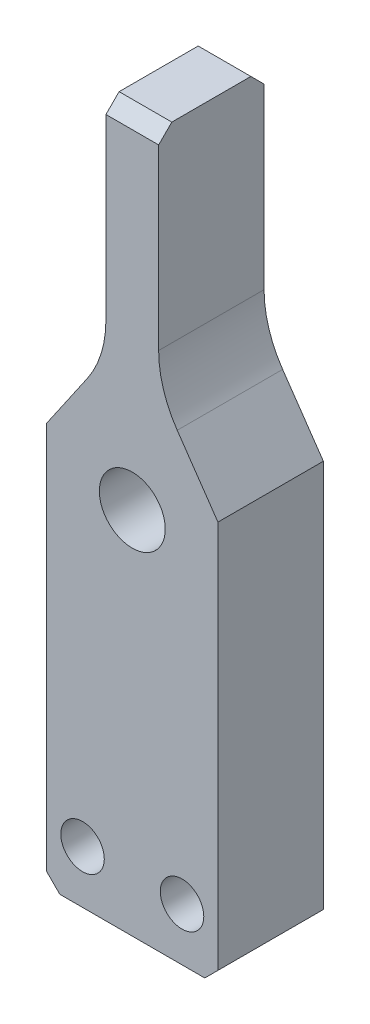
ISO-10303-21;
HEADER;
FILE_DESCRIPTION(('STEP AP214'),'2;1');
FILE_NAME('part.step','',(''),(''),'','','');
FILE_SCHEMA(('AUTOMOTIVE_DESIGN { 1 0 10303 214 1 1 1 1 }'));
ENDSEC;
DATA;
#1=APPLICATION_CONTEXT('core data for automotive mechanical design processes');
#2=APPLICATION_PROTOCOL_DEFINITION('international standard','automotive_design',2000,#1);
#3=PRODUCT_CONTEXT('',#1,'mechanical');
#4=PRODUCT('Part','Part','',(#3));
#5=PRODUCT_RELATED_PRODUCT_CATEGORY('part','',(#4));
#6=PRODUCT_DEFINITION_FORMATION('','',#4);
#7=PRODUCT_DEFINITION_CONTEXT('part definition',#1,'design');
#8=PRODUCT_DEFINITION('design','',#6,#7);
#9=PRODUCT_DEFINITION_SHAPE('','',#8);
#10=(LENGTH_UNIT() NAMED_UNIT(*) SI_UNIT(.MILLI.,.METRE.));
#11=(NAMED_UNIT(*) PLANE_ANGLE_UNIT() SI_UNIT($,.RADIAN.));
#12=(NAMED_UNIT(*) SI_UNIT($,.STERADIAN.) SOLID_ANGLE_UNIT());
#13=UNCERTAINTY_MEASURE_WITH_UNIT(LENGTH_MEASURE(1.E-05),#10,'distance_accuracy_value','');
#14=(GEOMETRIC_REPRESENTATION_CONTEXT(3) GLOBAL_UNCERTAINTY_ASSIGNED_CONTEXT((#13)) GLOBAL_UNIT_ASSIGNED_CONTEXT((#10,
#11,#12)) REPRESENTATION_CONTEXT('',''));
#15=CARTESIAN_POINT('',(0.,0.,0.));
#16=DIRECTION('',(0.,0.,1.));
#17=DIRECTION('',(1.,0.,0.));
#18=AXIS2_PLACEMENT_3D('',#15,#16,#17);
#19=CARTESIAN_POINT('',(-6.5,27.5,8.));
#20=DIRECTION('',(1.,0.,0.));
#21=DIRECTION('',(0.,1.,0.));
#22=AXIS2_PLACEMENT_3D('',#19,#20,#21);
#23=PLANE('',#22);
#24=DIRECTION('',(0.,-1.,0.));
#25=VECTOR('',#24,1.);
#26=CARTESIAN_POINT('',(-6.5,27.5,8.));
#27=LINE('',#26,#25);
#28=CARTESIAN_POINT('',(-6.5,2.96165158468899,8.));
#29=VERTEX_POINT('',#28);
#30=CARTESIAN_POINT('',(-6.49999999999999,-26.5,8.));
#31=VERTEX_POINT('',#30);
#32=EDGE_CURVE('E163',#29,#31,#27,.T.);
#33=ORIENTED_EDGE('',*,*,#32,.F.);
#34=DIRECTION('',(0.,0.,-1.));
#35=VECTOR('',#34,1.);
#36=CARTESIAN_POINT('',(-6.5,2.96165158468899,8.));
#37=LINE('',#36,#35);
#38=CARTESIAN_POINT('',(-6.49999999999999,2.96165158468902,0.));
#39=VERTEX_POINT('',#38);
#40=EDGE_CURVE('E194',#29,#39,#37,.T.);
#41=ORIENTED_EDGE('',*,*,#40,.T.);
#42=DIRECTION('',(0.,-1.,0.));
#43=VECTOR('',#42,1.);
#44=CARTESIAN_POINT('',(-6.5,27.5,0.));
#45=LINE('',#44,#43);
#46=CARTESIAN_POINT('',(-6.5,-26.5,0.));
#47=VERTEX_POINT('',#46);
#48=EDGE_CURVE('E168',#39,#47,#45,.T.);
#49=ORIENTED_EDGE('',*,*,#48,.T.);
#50=DIRECTION('',(0.,0.,1.));
#51=VECTOR('',#50,1.);
#52=CARTESIAN_POINT('',(-6.5,-26.5,8.));
#53=LINE('',#52,#51);
#54=EDGE_CURVE('E181',#47,#31,#53,.T.);
#55=ORIENTED_EDGE('',*,*,#54,.T.);
#56=EDGE_LOOP('',(#33,#41,#49,#55));
#57=FACE_BOUND('',#56,.T.);
#58=ADVANCED_FACE('F36',(#57),#23,.F.);
#59=CARTESIAN_POINT('',(6.50000000000001,-27.5,8.));
#60=DIRECTION('',(0.,1.,0.));
#61=DIRECTION('',(0.,0.,1.));
#62=AXIS2_PLACEMENT_3D('',#59,#60,#61);
#63=PLANE('',#62);
#64=DIRECTION('',(1.,0.,0.));
#65=VECTOR('',#64,1.);
#66=CARTESIAN_POINT('',(6.50000000000001,-27.5,0.));
#67=LINE('',#66,#65);
#68=CARTESIAN_POINT('',(-5.50000000000001,-27.5,0.));
#69=VERTEX_POINT('',#68);
#70=CARTESIAN_POINT('',(5.5,-27.5,0.));
#71=VERTEX_POINT('',#70);
#72=EDGE_CURVE('E164',#69,#71,#67,.T.);
#73=ORIENTED_EDGE('',*,*,#72,.T.);
#74=DIRECTION('',(0.,0.,1.));
#75=VECTOR('',#74,1.);
#76=CARTESIAN_POINT('',(5.5,-27.5,8.));
#77=LINE('',#76,#75);
#78=CARTESIAN_POINT('',(5.5,-27.5,8.));
#79=VERTEX_POINT('',#78);
#80=EDGE_CURVE('E141',#71,#79,#77,.T.);
#81=ORIENTED_EDGE('',*,*,#80,.T.);
#82=DIRECTION('',(1.,0.,0.));
#83=VECTOR('',#82,1.);
#84=CARTESIAN_POINT('',(6.50000000000001,-27.5,8.));
#85=LINE('',#84,#83);
#86=CARTESIAN_POINT('',(-5.5,-27.5,8.));
#87=VERTEX_POINT('',#86);
#88=EDGE_CURVE('E166',#87,#79,#85,.T.);
#89=ORIENTED_EDGE('',*,*,#88,.F.);
#90=DIRECTION('',(0.,0.,-1.));
#91=VECTOR('',#90,1.);
#92=CARTESIAN_POINT('',(-5.5,-27.5,8.));
#93=LINE('',#92,#91);
#94=EDGE_CURVE('E146',#87,#69,#93,.T.);
#95=ORIENTED_EDGE('',*,*,#94,.T.);
#96=EDGE_LOOP('',(#73,#81,#89,#95));
#97=FACE_BOUND('',#96,.T.);
#98=ADVANCED_FACE('F310',(#97),#63,.F.);
#99=CARTESIAN_POINT('',(6.5,27.5,8.));
#100=DIRECTION('',(-1.,0.,0.));
#101=DIRECTION('',(0.,-1.,0.));
#102=AXIS2_PLACEMENT_3D('',#99,#100,#101);
#103=PLANE('',#102);
#104=DIRECTION('',(0.,1.,0.));
#105=VECTOR('',#104,1.);
#106=CARTESIAN_POINT('',(6.5,27.5,0.));
#107=LINE('',#106,#105);
#108=CARTESIAN_POINT('',(6.50000000000001,-26.5,0.));
#109=VERTEX_POINT('',#108);
#110=CARTESIAN_POINT('',(6.5,2.96165158468892,0.));
#111=VERTEX_POINT('',#110);
#112=EDGE_CURVE('E154',#109,#111,#107,.T.);
#113=ORIENTED_EDGE('',*,*,#112,.T.);
#114=DIRECTION('',(0.,0.,1.));
#115=VECTOR('',#114,1.);
#116=CARTESIAN_POINT('',(6.5,2.96165158468891,8.));
#117=LINE('',#116,#115);
#118=CARTESIAN_POINT('',(6.5,2.96165158468893,8.));
#119=VERTEX_POINT('',#118);
#120=EDGE_CURVE('E184',#111,#119,#117,.T.);
#121=ORIENTED_EDGE('',*,*,#120,.T.);
#122=DIRECTION('',(0.,1.,0.));
#123=VECTOR('',#122,1.);
#124=CARTESIAN_POINT('',(6.5,27.5,8.));
#125=LINE('',#124,#123);
#126=CARTESIAN_POINT('',(6.50000000000001,-26.5,8.));
#127=VERTEX_POINT('',#126);
#128=EDGE_CURVE('E157',#127,#119,#125,.T.);
#129=ORIENTED_EDGE('',*,*,#128,.F.);
#130=DIRECTION('',(0.,0.,-1.));
#131=VECTOR('',#130,1.);
#132=CARTESIAN_POINT('',(6.50000000000001,-26.5,8.));
#133=LINE('',#132,#131);
#134=EDGE_CURVE('E140',#127,#109,#133,.T.);
#135=ORIENTED_EDGE('',*,*,#134,.T.);
#136=EDGE_LOOP('',(#113,#121,#129,#135));
#137=FACE_BOUND('',#136,.T.);
#138=ADVANCED_FACE('F152',(#137),#103,.F.);
#139=CARTESIAN_POINT('',(0.,0.,8.));
#140=DIRECTION('',(0.,0.,-1.));
#141=DIRECTION('',(-1.,0.,0.));
#142=AXIS2_PLACEMENT_3D('',#139,#140,#141);
#143=PLANE('',#142);
#144=CARTESIAN_POINT('',(-3.77499999991079,-23.5,8.));
#145=DIRECTION('',(0.,0.,1.));
#146=DIRECTION('',(1.,0.,0.));
#147=AXIS2_PLACEMENT_3D('',#144,#145,#146);
#148=CIRCLE('',#147,1.64999999999999);
#149=CARTESIAN_POINT('',(-2.1249999999108,-23.5,8.));
#150=VERTEX_POINT('',#149);
#151=EDGE_CURVE('E275',#150,#150,#148,.T.);
#152=ORIENTED_EDGE('',*,*,#151,.F.);
#153=EDGE_LOOP('',(#152));
#154=FACE_BOUND('',#153,.T.);
#155=CARTESIAN_POINT('',(3.77499999994489,-23.5,8.));
#156=DIRECTION('',(0.,0.,1.));
#157=DIRECTION('',(1.,0.,0.));
#158=AXIS2_PLACEMENT_3D('',#155,#156,#157);
#159=CIRCLE('',#158,1.64999999999999);
#160=CARTESIAN_POINT('',(5.42499999994488,-23.5,8.));
#161=VERTEX_POINT('',#160);
#162=EDGE_CURVE('E269',#161,#161,#159,.T.);
#163=ORIENTED_EDGE('',*,*,#162,.F.);
#164=EDGE_LOOP('',(#163));
#165=FACE_BOUND('',#164,.T.);
#166=CARTESIAN_POINT('',(0.,0.500000000000004,8.));
#167=DIRECTION('',(0.,0.,1.));
#168=DIRECTION('',(1.,0.,0.));
#169=AXIS2_PLACEMENT_3D('',#166,#167,#168);
#170=CIRCLE('',#169,2.5);
#171=CARTESIAN_POINT('',(2.5,0.500000000000004,8.));
#172=VERTEX_POINT('',#171);
#173=EDGE_CURVE('E255',#172,#172,#170,.T.);
#174=ORIENTED_EDGE('',*,*,#173,.F.);
#175=EDGE_LOOP('',(#174));
#176=FACE_BOUND('',#175,.T.);
#177=DIRECTION('',(0.,-1.,0.));
#178=VECTOR('',#177,1.);
#179=CARTESIAN_POINT('',(2.,27.5,8.));
#180=LINE('',#179,#178);
#181=CARTESIAN_POINT('',(2.,25.5,8.));
#182=VERTEX_POINT('',#181);
#183=CARTESIAN_POINT('',(2.,11.9869431429027,8.));
#184=VERTEX_POINT('',#183);
#185=EDGE_CURVE('E232',#182,#184,#180,.T.);
#186=ORIENTED_EDGE('',*,*,#185,.F.);
#187=DIRECTION('',(-1.,0.,0.));
#188=VECTOR('',#187,1.);
#189=CARTESIAN_POINT('',(0.,25.5,8.));
#190=LINE('',#189,#188);
#191=CARTESIAN_POINT('',(-2.,25.5,8.));
#192=VERTEX_POINT('',#191);
#193=EDGE_CURVE('E213',#182,#192,#190,.T.);
#194=ORIENTED_EDGE('',*,*,#193,.T.);
#195=DIRECTION('',(0.,1.,0.));
#196=VECTOR('',#195,1.);
#197=CARTESIAN_POINT('',(-2.,27.5,8.));
#198=LINE('',#197,#196);
#199=CARTESIAN_POINT('',(-2.,11.9869431429027,8.));
#200=VERTEX_POINT('',#199);
#201=EDGE_CURVE('E263',#200,#192,#198,.T.);
#202=ORIENTED_EDGE('',*,*,#201,.F.);
#203=CARTESIAN_POINT('',(-10.,11.9869431429027,8.));
#204=DIRECTION('',(0.,0.,-1.));
#205=DIRECTION('',(-1.,0.,0.));
#206=AXIS2_PLACEMENT_3D('',#203,#204,#205);
#207=CIRCLE('',#206,8.);
#208=CARTESIAN_POINT('',(-3.40996423161669,7.45136946679193,8.));
#209=VERTEX_POINT('',#208);
#210=EDGE_CURVE('E44',#200,#209,#207,.T.);
#211=ORIENTED_EDGE('',*,*,#210,.T.);
#212=DIRECTION('',(-0.566946709513842,-0.823754471047913,0.));
#213=VECTOR('',#212,1.);
#214=CARTESIAN_POINT('',(-3.28571428571426,7.6319004527683,8.));
#215=LINE('',#214,#213);
#216=EDGE_CURVE('E186',#209,#29,#215,.T.);
#217=ORIENTED_EDGE('',*,*,#216,.T.);
#218=ORIENTED_EDGE('',*,*,#32,.T.);
#219=DIRECTION('',(-0.707106781186545,0.70710678118655,0.));
#220=VECTOR('',#219,1.);
#221=CARTESIAN_POINT('',(-5.5,-27.5,8.));
#222=LINE('',#221,#220);
#223=EDGE_CURVE('E177',#31,#87,#222,.F.);
#224=ORIENTED_EDGE('',*,*,#223,.T.);
#225=ORIENTED_EDGE('',*,*,#88,.T.);
#226=DIRECTION('',(-0.70710678118655,-0.707106781186545,0.));
#227=VECTOR('',#226,1.);
#228=CARTESIAN_POINT('',(6.50000000000001,-26.5,8.));
#229=LINE('',#228,#227);
#230=EDGE_CURVE('E179',#79,#127,#229,.F.);
#231=ORIENTED_EDGE('',*,*,#230,.T.);
#232=ORIENTED_EDGE('',*,*,#128,.T.);
#233=DIRECTION('',(-0.566946709513834,0.823754471047919,0.));
#234=VECTOR('',#233,1.);
#235=CARTESIAN_POINT('',(6.5,2.96165158468891,8.));
#236=LINE('',#235,#234);
#237=CARTESIAN_POINT('',(3.40996423161665,7.45136946679201,8.));
#238=VERTEX_POINT('',#237);
#239=EDGE_CURVE('E188',#119,#238,#236,.T.);
#240=ORIENTED_EDGE('',*,*,#239,.T.);
#241=CARTESIAN_POINT('',(10.,11.9869431429027,8.));
#242=DIRECTION('',(0.,0.,-1.));
#243=DIRECTION('',(-1.,0.,0.));
#244=AXIS2_PLACEMENT_3D('',#241,#242,#243);
#245=CIRCLE('',#244,8.);
#246=EDGE_CURVE('E227',#238,#184,#245,.T.);
#247=ORIENTED_EDGE('',*,*,#246,.T.);
#248=EDGE_LOOP('',(#186,#194,#202,#211,#217,#218,#224,#225,#231,#232,#240,#247));
#249=FACE_BOUND('',#248,.T.);
#250=ADVANCED_FACE('F231',(#154,#165,#176,#249),#143,.F.);
#251=CARTESIAN_POINT('',(0.,0.,0.));
#252=DIRECTION('',(0.,0.,-1.));
#253=DIRECTION('',(-1.,0.,0.));
#254=AXIS2_PLACEMENT_3D('',#251,#252,#253);
#255=PLANE('',#254);
#256=DIRECTION('',(0.566946709513842,0.823754471047913,0.));
#257=VECTOR('',#256,1.);
#258=CARTESIAN_POINT('',(-5.79387928181817,3.98762120218729,0.));
#259=LINE('',#258,#257);
#260=CARTESIAN_POINT('',(-3.40996423161669,7.45136946679193,0.));
#261=VERTEX_POINT('',#260);
#262=EDGE_CURVE('E191',#39,#261,#259,.T.);
#263=ORIENTED_EDGE('',*,*,#262,.T.);
#264=CARTESIAN_POINT('',(-10.,11.9869431429027,0.));
#265=DIRECTION('',(0.,0.,-1.));
#266=DIRECTION('',(-1.,0.,0.));
#267=AXIS2_PLACEMENT_3D('',#264,#265,#266);
#268=CIRCLE('',#267,8.);
#269=CARTESIAN_POINT('',(-2.,11.9869431429027,0.));
#270=VERTEX_POINT('',#269);
#271=EDGE_CURVE('E11',#261,#270,#268,.F.);
#272=ORIENTED_EDGE('',*,*,#271,.T.);
#273=DIRECTION('',(0.,1.,0.));
#274=VECTOR('',#273,1.);
#275=CARTESIAN_POINT('',(-2.,27.5,0.));
#276=LINE('',#275,#274);
#277=CARTESIAN_POINT('',(-2.,25.5,0.));
#278=VERTEX_POINT('',#277);
#279=EDGE_CURVE('E243',#270,#278,#276,.T.);
#280=ORIENTED_EDGE('',*,*,#279,.T.);
#281=DIRECTION('',(1.,0.,0.));
#282=VECTOR('',#281,1.);
#283=CARTESIAN_POINT('',(2.,25.5,0.));
#284=LINE('',#283,#282);
#285=CARTESIAN_POINT('',(2.,25.5,0.));
#286=VERTEX_POINT('',#285);
#287=EDGE_CURVE('E207',#278,#286,#284,.T.);
#288=ORIENTED_EDGE('',*,*,#287,.T.);
#289=DIRECTION('',(0.,-1.,0.));
#290=VECTOR('',#289,1.);
#291=CARTESIAN_POINT('',(2.,27.5,0.));
#292=LINE('',#291,#290);
#293=CARTESIAN_POINT('',(2.,11.9869431429027,0.));
#294=VERTEX_POINT('',#293);
#295=EDGE_CURVE('E242',#286,#294,#292,.T.);
#296=ORIENTED_EDGE('',*,*,#295,.T.);
#297=CARTESIAN_POINT('',(10.,11.9869431429027,0.));
#298=DIRECTION('',(0.,0.,-1.));
#299=DIRECTION('',(-1.,0.,0.));
#300=AXIS2_PLACEMENT_3D('',#297,#298,#299);
#301=CIRCLE('',#300,8.);
#302=CARTESIAN_POINT('',(3.40996423161665,7.45136946679201,0.));
#303=VERTEX_POINT('',#302);
#304=EDGE_CURVE('E225',#294,#303,#301,.F.);
#305=ORIENTED_EDGE('',*,*,#304,.T.);
#306=DIRECTION('',(0.566946709513834,-0.823754471047919,0.));
#307=VECTOR('',#306,1.);
#308=CARTESIAN_POINT('',(5.79387928181819,3.98762120218722,0.));
#309=LINE('',#308,#307);
#310=EDGE_CURVE('E162',#303,#111,#309,.T.);
#311=ORIENTED_EDGE('',*,*,#310,.T.);
#312=ORIENTED_EDGE('',*,*,#112,.F.);
#313=DIRECTION('',(0.70710678118655,0.707106781186545,0.));
#314=VECTOR('',#313,1.);
#315=CARTESIAN_POINT('',(16.5,-16.5000000000001,0.));
#316=LINE('',#315,#314);
#317=EDGE_CURVE('E136',#109,#71,#316,.F.);
#318=ORIENTED_EDGE('',*,*,#317,.T.);
#319=ORIENTED_EDGE('',*,*,#72,.F.);
#320=DIRECTION('',(0.707106781186545,-0.70710678118655,0.));
#321=VECTOR('',#320,1.);
#322=CARTESIAN_POINT('',(-16.5,-16.4999999999999,0.));
#323=LINE('',#322,#321);
#324=EDGE_CURVE('E147',#69,#47,#323,.F.);
#325=ORIENTED_EDGE('',*,*,#324,.T.);
#326=ORIENTED_EDGE('',*,*,#48,.F.);
#327=EDGE_LOOP('',(#263,#272,#280,#288,#296,#305,#311,#312,#318,#319,#325,#326));
#328=FACE_BOUND('',#327,.T.);
#329=CARTESIAN_POINT('',(-3.77499999991079,-23.5,0.));
#330=DIRECTION('',(0.,0.,1.));
#331=DIRECTION('',(1.,0.,0.));
#332=AXIS2_PLACEMENT_3D('',#329,#330,#331);
#333=CIRCLE('',#332,1.65);
#334=CARTESIAN_POINT('',(-2.12499999991079,-23.5,0.));
#335=VERTEX_POINT('',#334);
#336=EDGE_CURVE('E272',#335,#335,#333,.T.);
#337=ORIENTED_EDGE('',*,*,#336,.T.);
#338=EDGE_LOOP('',(#337));
#339=FACE_BOUND('',#338,.T.);
#340=CARTESIAN_POINT('',(3.77499999994489,-23.5,0.));
#341=DIRECTION('',(0.,0.,1.));
#342=DIRECTION('',(1.,0.,0.));
#343=AXIS2_PLACEMENT_3D('',#340,#341,#342);
#344=CIRCLE('',#343,1.65);
#345=CARTESIAN_POINT('',(5.42499999994489,-23.5,0.));
#346=VERTEX_POINT('',#345);
#347=EDGE_CURVE('E265',#346,#346,#344,.T.);
#348=ORIENTED_EDGE('',*,*,#347,.T.);
#349=EDGE_LOOP('',(#348));
#350=FACE_BOUND('',#349,.T.);
#351=CARTESIAN_POINT('',(0.,0.500000000000004,0.));
#352=DIRECTION('',(0.,0.,1.));
#353=DIRECTION('',(1.,0.,0.));
#354=AXIS2_PLACEMENT_3D('',#351,#352,#353);
#355=CIRCLE('',#354,2.5);
#356=CARTESIAN_POINT('',(2.5,0.500000000000004,0.));
#357=VERTEX_POINT('',#356);
#358=EDGE_CURVE('E251',#357,#357,#355,.T.);
#359=ORIENTED_EDGE('',*,*,#358,.T.);
#360=EDGE_LOOP('',(#359));
#361=FACE_BOUND('',#360,.T.);
#362=ADVANCED_FACE('F159',(#328,#339,#350,#361),#255,.T.);
#363=CARTESIAN_POINT('',(0.,0.500000000000004,8.));
#364=DIRECTION('',(0.,0.,1.));
#365=DIRECTION('',(1.,0.,0.));
#366=AXIS2_PLACEMENT_3D('',#363,#364,#365);
#367=CYLINDRICAL_SURFACE('',#366,2.5);
#368=ORIENTED_EDGE('',*,*,#358,.F.);
#369=EDGE_LOOP('',(#368));
#370=FACE_BOUND('',#369,.T.);
#371=ORIENTED_EDGE('',*,*,#173,.T.);
#372=EDGE_LOOP('',(#371));
#373=FACE_BOUND('',#372,.T.);
#374=ADVANCED_FACE('F335',(#370,#373),#367,.F.);
#375=CARTESIAN_POINT('',(2.,27.5,0.));
#376=DIRECTION('',(-1.,0.,0.));
#377=DIRECTION('',(0.,-1.,0.));
#378=AXIS2_PLACEMENT_3D('',#375,#376,#377);
#379=PLANE('',#378);
#380=ORIENTED_EDGE('',*,*,#185,.T.);
#381=DIRECTION('',(0.,0.,-1.));
#382=VECTOR('',#381,1.);
#383=CARTESIAN_POINT('',(2.,11.9869431429027,0.));
#384=LINE('',#383,#382);
#385=EDGE_CURVE('E216',#184,#294,#384,.T.);
#386=ORIENTED_EDGE('',*,*,#385,.T.);
#387=ORIENTED_EDGE('',*,*,#295,.F.);
#388=DIRECTION('',(0.,0.70710678118655,0.707106781186545));
#389=VECTOR('',#388,1.);
#390=CARTESIAN_POINT('',(2.,26.5,1.));
#391=LINE('',#390,#389);
#392=CARTESIAN_POINT('',(2.,26.5,1.));
#393=VERTEX_POINT('',#392);
#394=EDGE_CURVE('E211',#286,#393,#391,.T.);
#395=ORIENTED_EDGE('',*,*,#394,.T.);
#396=DIRECTION('',(0.,0.,-1.));
#397=VECTOR('',#396,1.);
#398=CARTESIAN_POINT('',(2.,26.5,0.));
#399=LINE('',#398,#397);
#400=CARTESIAN_POINT('',(2.,26.5,7.));
#401=VERTEX_POINT('',#400);
#402=EDGE_CURVE('E281',#401,#393,#399,.T.);
#403=ORIENTED_EDGE('',*,*,#402,.F.);
#404=DIRECTION('',(0.,0.70710678118655,-0.707106781186545));
#405=VECTOR('',#404,1.);
#406=CARTESIAN_POINT('',(2.,26.5,7.));
#407=LINE('',#406,#405);
#408=EDGE_CURVE('E209',#401,#182,#407,.F.);
#409=ORIENTED_EDGE('',*,*,#408,.T.);
#410=EDGE_LOOP('',(#380,#386,#387,#395,#403,#409));
#411=FACE_BOUND('',#410,.T.);
#412=ADVANCED_FACE('F238',(#411),#379,.F.);
#413=CARTESIAN_POINT('',(-2.,27.5,0.));
#414=DIRECTION('',(1.,0.,0.));
#415=DIRECTION('',(0.,0.,-1.));
#416=AXIS2_PLACEMENT_3D('',#413,#414,#415);
#417=PLANE('',#416);
#418=ORIENTED_EDGE('',*,*,#279,.F.);
#419=DIRECTION('',(0.,0.,1.));
#420=VECTOR('',#419,1.);
#421=CARTESIAN_POINT('',(-2.,11.9869431429027,0.));
#422=LINE('',#421,#420);
#423=EDGE_CURVE('E221',#270,#200,#422,.T.);
#424=ORIENTED_EDGE('',*,*,#423,.T.);
#425=ORIENTED_EDGE('',*,*,#201,.T.);
#426=DIRECTION('',(0.,-0.70710678118655,0.707106781186545));
#427=VECTOR('',#426,1.);
#428=CARTESIAN_POINT('',(-2.,26.5,7.));
#429=LINE('',#428,#427);
#430=CARTESIAN_POINT('',(-2.,26.5,7.));
#431=VERTEX_POINT('',#430);
#432=EDGE_CURVE('E202',#192,#431,#429,.F.);
#433=ORIENTED_EDGE('',*,*,#432,.T.);
#434=DIRECTION('',(0.,0.,1.));
#435=VECTOR('',#434,1.);
#436=CARTESIAN_POINT('',(-2.,26.5,0.));
#437=LINE('',#436,#435);
#438=CARTESIAN_POINT('',(-2.,26.5,1.));
#439=VERTEX_POINT('',#438);
#440=EDGE_CURVE('E278',#439,#431,#437,.T.);
#441=ORIENTED_EDGE('',*,*,#440,.F.);
#442=DIRECTION('',(0.,-0.70710678118655,-0.707106781186545));
#443=VECTOR('',#442,1.);
#444=CARTESIAN_POINT('',(-2.,26.5,1.));
#445=LINE('',#444,#443);
#446=EDGE_CURVE('E204',#439,#278,#445,.T.);
#447=ORIENTED_EDGE('',*,*,#446,.T.);
#448=EDGE_LOOP('',(#418,#424,#425,#433,#441,#447));
#449=FACE_BOUND('',#448,.T.);
#450=ADVANCED_FACE('F294',(#449),#417,.F.);
#451=CARTESIAN_POINT('',(6.50000000000001,-26.5,8.));
#452=DIRECTION('',(-0.707106781186545,0.70710678118655,0.));
#453=DIRECTION('',(0.,0.,-1.));
#454=AXIS2_PLACEMENT_3D('',#451,#452,#453);
#455=PLANE('',#454);
#456=ORIENTED_EDGE('',*,*,#230,.F.);
#457=ORIENTED_EDGE('',*,*,#80,.F.);
#458=ORIENTED_EDGE('',*,*,#317,.F.);
#459=ORIENTED_EDGE('',*,*,#134,.F.);
#460=EDGE_LOOP('',(#456,#457,#458,#459));
#461=FACE_BOUND('',#460,.T.);
#462=ADVANCED_FACE('F139',(#461),#455,.F.);
#463=CARTESIAN_POINT('',(-5.5,-27.5,8.));
#464=DIRECTION('',(0.70710678118655,0.707106781186545,0.));
#465=DIRECTION('',(0.,0.,-1.));
#466=AXIS2_PLACEMENT_3D('',#463,#464,#465);
#467=PLANE('',#466);
#468=ORIENTED_EDGE('',*,*,#223,.F.);
#469=ORIENTED_EDGE('',*,*,#54,.F.);
#470=ORIENTED_EDGE('',*,*,#324,.F.);
#471=ORIENTED_EDGE('',*,*,#94,.F.);
#472=EDGE_LOOP('',(#468,#469,#470,#471));
#473=FACE_BOUND('',#472,.T.);
#474=ADVANCED_FACE('F311',(#473),#467,.F.);
#475=CARTESIAN_POINT('',(3.77499999994489,-23.5,8.));
#476=DIRECTION('',(0.,0.,1.));
#477=DIRECTION('',(1.,0.,0.));
#478=AXIS2_PLACEMENT_3D('',#475,#476,#477);
#479=CYLINDRICAL_SURFACE('',#478,1.64999999999999);
#480=ORIENTED_EDGE('',*,*,#347,.F.);
#481=EDGE_LOOP('',(#480));
#482=FACE_BOUND('',#481,.T.);
#483=ORIENTED_EDGE('',*,*,#162,.T.);
#484=EDGE_LOOP('',(#483));
#485=FACE_BOUND('',#484,.T.);
#486=ADVANCED_FACE('F313',(#482,#485),#479,.F.);
#487=CARTESIAN_POINT('',(-3.77499999991079,-23.5,8.));
#488=DIRECTION('',(0.,0.,1.));
#489=DIRECTION('',(1.,0.,0.));
#490=AXIS2_PLACEMENT_3D('',#487,#488,#489);
#491=CYLINDRICAL_SURFACE('',#490,1.64999999999999);
#492=ORIENTED_EDGE('',*,*,#336,.F.);
#493=EDGE_LOOP('',(#492));
#494=FACE_BOUND('',#493,.T.);
#495=ORIENTED_EDGE('',*,*,#151,.T.);
#496=EDGE_LOOP('',(#495));
#497=FACE_BOUND('',#496,.T.);
#498=ADVANCED_FACE('F319',(#494,#497),#491,.F.);
#499=CARTESIAN_POINT('',(6.5,2.96165158468891,0.));
#500=DIRECTION('',(0.823754471047919,0.566946709513834,0.));
#501=DIRECTION('',(0.,0.,-1.));
#502=AXIS2_PLACEMENT_3D('',#499,#500,#501);
#503=PLANE('',#502);
#504=ORIENTED_EDGE('',*,*,#310,.F.);
#505=DIRECTION('',(0.,0.,-1.));
#506=VECTOR('',#505,1.);
#507=CARTESIAN_POINT('',(3.40996423161665,7.45136946679201,0.));
#508=LINE('',#507,#506);
#509=EDGE_CURVE('E219',#303,#238,#508,.F.);
#510=ORIENTED_EDGE('',*,*,#509,.T.);
#511=ORIENTED_EDGE('',*,*,#239,.F.);
#512=ORIENTED_EDGE('',*,*,#120,.F.);
#513=EDGE_LOOP('',(#504,#510,#511,#512));
#514=FACE_BOUND('',#513,.T.);
#515=ADVANCED_FACE('F247',(#514),#503,.T.);
#516=CARTESIAN_POINT('',(-3.28571428571426,7.6319004527683,0.));
#517=DIRECTION('',(-0.823754471047913,0.566946709513842,0.));
#518=DIRECTION('',(0.,0.,-1.));
#519=AXIS2_PLACEMENT_3D('',#516,#517,#518);
#520=PLANE('',#519);
#521=ORIENTED_EDGE('',*,*,#216,.F.);
#522=DIRECTION('',(0.,0.,1.));
#523=VECTOR('',#522,1.);
#524=CARTESIAN_POINT('',(-3.40996423161669,7.45136946679193,0.));
#525=LINE('',#524,#523);
#526=EDGE_CURVE('E57',#209,#261,#525,.F.);
#527=ORIENTED_EDGE('',*,*,#526,.T.);
#528=ORIENTED_EDGE('',*,*,#262,.F.);
#529=ORIENTED_EDGE('',*,*,#40,.F.);
#530=EDGE_LOOP('',(#521,#527,#528,#529));
#531=FACE_BOUND('',#530,.T.);
#532=ADVANCED_FACE('F302',(#531),#520,.T.);
#533=CARTESIAN_POINT('',(0.,26.5,0.));
#534=DIRECTION('',(0.,-1.,0.));
#535=DIRECTION('',(0.,0.,-1.));
#536=AXIS2_PLACEMENT_3D('',#533,#534,#535);
#537=PLANE('',#536);
#538=ORIENTED_EDGE('',*,*,#402,.T.);
#539=DIRECTION('',(-1.,0.,0.));
#540=VECTOR('',#539,1.);
#541=CARTESIAN_POINT('',(-2.,26.5,1.));
#542=LINE('',#541,#540);
#543=EDGE_CURVE('E199',#393,#439,#542,.T.);
#544=ORIENTED_EDGE('',*,*,#543,.T.);
#545=ORIENTED_EDGE('',*,*,#440,.T.);
#546=DIRECTION('',(1.,0.,0.));
#547=VECTOR('',#546,1.);
#548=CARTESIAN_POINT('',(0.,26.5,7.));
#549=LINE('',#548,#547);
#550=EDGE_CURVE('E196',#431,#401,#549,.T.);
#551=ORIENTED_EDGE('',*,*,#550,.T.);
#552=EDGE_LOOP('',(#538,#544,#545,#551));
#553=FACE_BOUND('',#552,.T.);
#554=ADVANCED_FACE('F285',(#553),#537,.F.);
#555=CARTESIAN_POINT('',(0.,26.5,1.));
#556=DIRECTION('',(0.,0.707106781186545,-0.70710678118655));
#557=DIRECTION('',(1.,0.,0.));
#558=AXIS2_PLACEMENT_3D('',#555,#556,#557);
#559=PLANE('',#558);
#560=ORIENTED_EDGE('',*,*,#394,.F.);
#561=ORIENTED_EDGE('',*,*,#287,.F.);
#562=ORIENTED_EDGE('',*,*,#446,.F.);
#563=ORIENTED_EDGE('',*,*,#543,.F.);
#564=EDGE_LOOP('',(#560,#561,#562,#563));
#565=FACE_BOUND('',#564,.T.);
#566=ADVANCED_FACE('F290',(#565),#559,.T.);
#567=CARTESIAN_POINT('',(0.,26.5,7.));
#568=DIRECTION('',(0.,-0.707106781186545,-0.70710678118655));
#569=DIRECTION('',(1.,0.,0.));
#570=AXIS2_PLACEMENT_3D('',#567,#568,#569);
#571=PLANE('',#570);
#572=ORIENTED_EDGE('',*,*,#432,.F.);
#573=ORIENTED_EDGE('',*,*,#193,.F.);
#574=ORIENTED_EDGE('',*,*,#408,.F.);
#575=ORIENTED_EDGE('',*,*,#550,.F.);
#576=EDGE_LOOP('',(#572,#573,#574,#575));
#577=FACE_BOUND('',#576,.T.);
#578=ADVANCED_FACE('F298',(#577),#571,.F.);
#579=CARTESIAN_POINT('',(10.,11.9869431429027,0.));
#580=DIRECTION('',(0.,0.,-1.));
#581=DIRECTION('',(-1.,0.,0.));
#582=AXIS2_PLACEMENT_3D('',#579,#580,#581);
#583=CYLINDRICAL_SURFACE('',#582,8.);
#584=ORIENTED_EDGE('',*,*,#246,.F.);
#585=ORIENTED_EDGE('',*,*,#509,.F.);
#586=ORIENTED_EDGE('',*,*,#304,.F.);
#587=ORIENTED_EDGE('',*,*,#385,.F.);
#588=EDGE_LOOP('',(#584,#585,#586,#587));
#589=FACE_BOUND('',#588,.T.);
#590=ADVANCED_FACE('F245',(#589),#583,.F.);
#591=CARTESIAN_POINT('',(-10.,11.9869431429027,0.));
#592=DIRECTION('',(0.,0.,1.));
#593=DIRECTION('',(1.,0.,0.));
#594=AXIS2_PLACEMENT_3D('',#591,#592,#593);
#595=CYLINDRICAL_SURFACE('',#594,8.);
#596=ORIENTED_EDGE('',*,*,#271,.F.);
#597=ORIENTED_EDGE('',*,*,#526,.F.);
#598=ORIENTED_EDGE('',*,*,#210,.F.);
#599=ORIENTED_EDGE('',*,*,#423,.F.);
#600=EDGE_LOOP('',(#596,#597,#598,#599));
#601=FACE_BOUND('',#600,.T.);
#602=ADVANCED_FACE('F38',(#601),#595,.F.);
#603=CLOSED_SHELL('',(#58,#98,#138,#250,#362,#374,#412,#450,#462,#474,#486,#498,#515,#532,#554,
#566,#578,#590,#602));
#604=MANIFOLD_SOLID_BREP('B2',#603);
#605=ADVANCED_BREP_SHAPE_REPRESENTATION('',(#18,#604),#14);
#606=SHAPE_DEFINITION_REPRESENTATION(#9,#605);
ENDSEC;
END-ISO-10303-21;
